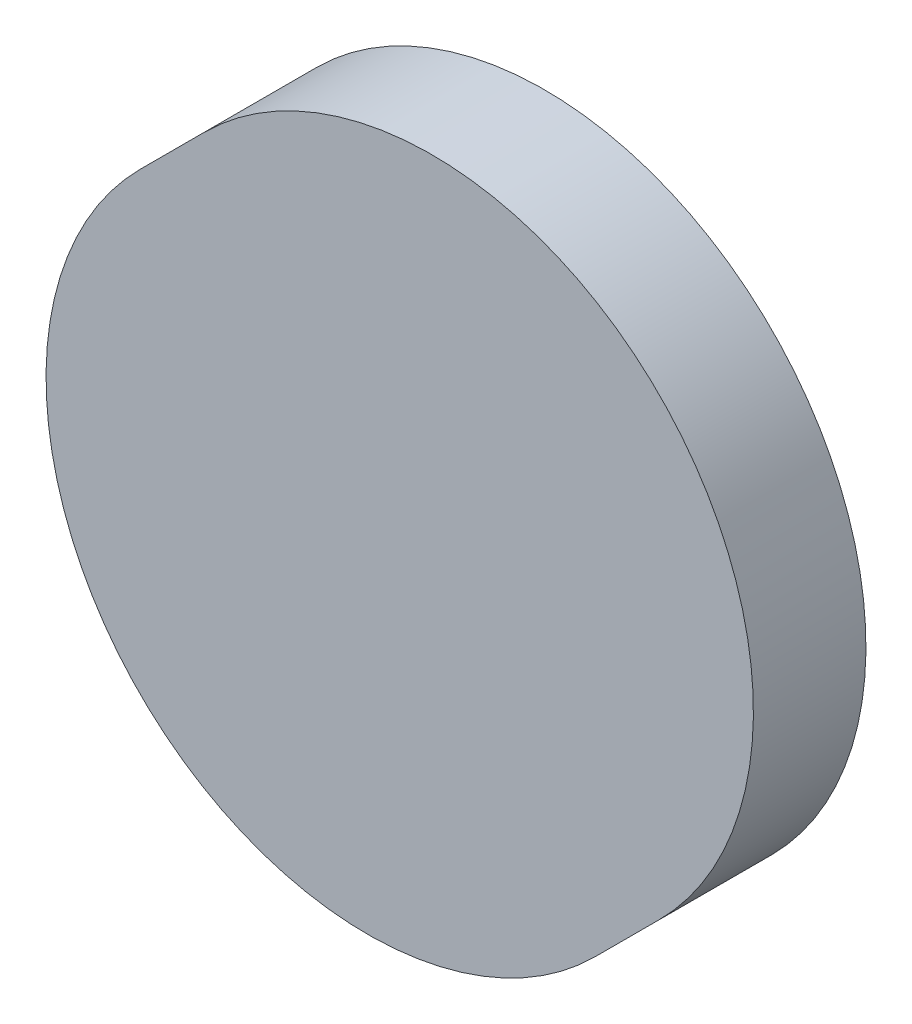
ISO-10303-21;
HEADER;
FILE_DESCRIPTION(('STEP AP214'),'2;1');
FILE_NAME('part.step','',(''),(''),'','','');
FILE_SCHEMA(('AUTOMOTIVE_DESIGN { 1 0 10303 214 1 1 1 1 }'));
ENDSEC;
DATA;
#1=APPLICATION_CONTEXT('core data for automotive mechanical design processes');
#2=APPLICATION_PROTOCOL_DEFINITION('international standard','automotive_design',2000,#1);
#3=PRODUCT_CONTEXT('',#1,'mechanical');
#4=PRODUCT('Part','Part','',(#3));
#5=PRODUCT_RELATED_PRODUCT_CATEGORY('part','',(#4));
#6=PRODUCT_DEFINITION_FORMATION('','',#4);
#7=PRODUCT_DEFINITION_CONTEXT('part definition',#1,'design');
#8=PRODUCT_DEFINITION('design','',#6,#7);
#9=PRODUCT_DEFINITION_SHAPE('','',#8);
#10=(LENGTH_UNIT() NAMED_UNIT(*) SI_UNIT(.MILLI.,.METRE.));
#11=(NAMED_UNIT(*) PLANE_ANGLE_UNIT() SI_UNIT($,.RADIAN.));
#12=(NAMED_UNIT(*) SI_UNIT($,.STERADIAN.) SOLID_ANGLE_UNIT());
#13=UNCERTAINTY_MEASURE_WITH_UNIT(LENGTH_MEASURE(1.E-05),#10,'distance_accuracy_value','');
#14=(GEOMETRIC_REPRESENTATION_CONTEXT(3) GLOBAL_UNCERTAINTY_ASSIGNED_CONTEXT((#13)) GLOBAL_UNIT_ASSIGNED_CONTEXT((#10,
#11,#12)) REPRESENTATION_CONTEXT('',''));
#15=CARTESIAN_POINT('',(0.,0.,0.));
#16=DIRECTION('',(0.,0.,1.));
#17=DIRECTION('',(1.,0.,0.));
#18=AXIS2_PLACEMENT_3D('',#15,#16,#17);
#19=CARTESIAN_POINT('',(88.55071,-136.10571,1.635));
#20=DIRECTION('',(0.,0.,1.));
#21=DIRECTION('',(1.,0.,0.));
#22=AXIS2_PLACEMENT_3D('',#19,#20,#21);
#23=PLANE('',#22);
#24=DIRECTION('',(0.707106781187048,0.707106781186048,0.));
#25=VECTOR('',#24,1.);
#26=CARTESIAN_POINT('',(88.55071,-136.10571,1.635));
#27=LINE('',#26,#25);
#28=CARTESIAN_POINT('',(88.55071,-136.10571,1.635));
#29=VERTEX_POINT('',#28);
#30=CARTESIAN_POINT('',(88.57071,-136.08571,1.635));
#31=VERTEX_POINT('',#30);
#32=EDGE_CURVE('E81',#29,#31,#27,.T.);
#33=ORIENTED_EDGE('',*,*,#32,.T.);
#34=CARTESIAN_POINT('',(88.4999995,-136.0149995,1.635));
#35=DIRECTION('',(0.,0.,1.));
#36=DIRECTION('',(0.707106781186048,-0.707106781187047,0.));
#37=AXIS2_PLACEMENT_3D('',#34,#35,#36);
#38=CIRCLE('',#37,0.09999974810219);
#39=CARTESIAN_POINT('',(88.429289,-135.944289,1.635));
#40=VERTEX_POINT('',#39);
#41=EDGE_CURVE('E108',#31,#40,#38,.T.);
#42=ORIENTED_EDGE('',*,*,#41,.T.);
#43=DIRECTION('',(-0.707106781186048,-0.707106781187048,0.));
#44=VECTOR('',#43,1.);
#45=CARTESIAN_POINT('',(88.429289,-135.944289,1.635));
#46=LINE('',#45,#44);
#47=CARTESIAN_POINT('',(88.409289,-135.964289,1.635));
#48=VERTEX_POINT('',#47);
#49=EDGE_CURVE('E74',#40,#48,#46,.T.);
#50=ORIENTED_EDGE('',*,*,#49,.T.);
#51=CARTESIAN_POINT('',(88.4799995,-136.0349995,1.635));
#52=DIRECTION('',(0.,0.,1.));
#53=DIRECTION('',(-0.707106781186548,0.707106781186548,0.));
#54=AXIS2_PLACEMENT_3D('',#51,#52,#53);
#55=CIRCLE('',#54,0.09999974810217);
#56=EDGE_CURVE('E11',#48,#29,#55,.T.);
#57=ORIENTED_EDGE('',*,*,#56,.T.);
#58=EDGE_LOOP('',(#33,#42,#50,#57));
#59=FACE_BOUND('',#58,.T.);
#60=ADVANCED_FACE('F17',(#59),#23,.T.);
#61=CARTESIAN_POINT('',(88.55071,-136.10571,1.6));
#62=DIRECTION('',(0.,0.,1.));
#63=DIRECTION('',(1.,0.,0.));
#64=AXIS2_PLACEMENT_3D('',#61,#62,#63);
#65=PLANE('',#64);
#66=CARTESIAN_POINT('',(88.4799995,-136.0349995,1.6));
#67=DIRECTION('',(0.,0.,1.));
#68=DIRECTION('',(-0.707106781186548,0.707106781186548,0.));
#69=AXIS2_PLACEMENT_3D('',#66,#67,#68);
#70=CIRCLE('',#69,0.09999974810217);
#71=CARTESIAN_POINT('',(88.409289,-135.964289,1.6));
#72=VERTEX_POINT('',#71);
#73=CARTESIAN_POINT('',(88.55071,-136.10571,1.6));
#74=VERTEX_POINT('',#73);
#75=EDGE_CURVE('E25',#72,#74,#70,.T.);
#76=ORIENTED_EDGE('',*,*,#75,.F.);
#77=DIRECTION('',(-0.707106781186048,-0.707106781187048,0.));
#78=VECTOR('',#77,1.);
#79=CARTESIAN_POINT('',(88.429289,-135.944289,1.6));
#80=LINE('',#79,#78);
#81=CARTESIAN_POINT('',(88.429289,-135.944289,1.6));
#82=VERTEX_POINT('',#81);
#83=EDGE_CURVE('E99',#82,#72,#80,.T.);
#84=ORIENTED_EDGE('',*,*,#83,.F.);
#85=CARTESIAN_POINT('',(88.4999995,-136.0149995,1.6));
#86=DIRECTION('',(0.,0.,1.));
#87=DIRECTION('',(0.707106781186048,-0.707106781187047,0.));
#88=AXIS2_PLACEMENT_3D('',#85,#86,#87);
#89=CIRCLE('',#88,0.09999974810219);
#90=CARTESIAN_POINT('',(88.57071,-136.08571,1.6));
#91=VERTEX_POINT('',#90);
#92=EDGE_CURVE('E83',#91,#82,#89,.T.);
#93=ORIENTED_EDGE('',*,*,#92,.F.);
#94=DIRECTION('',(0.707106781187048,0.707106781186048,0.));
#95=VECTOR('',#94,1.);
#96=CARTESIAN_POINT('',(88.55071,-136.10571,1.6));
#97=LINE('',#96,#95);
#98=EDGE_CURVE('E79',#74,#91,#97,.T.);
#99=ORIENTED_EDGE('',*,*,#98,.F.);
#100=EDGE_LOOP('',(#76,#84,#93,#99));
#101=FACE_BOUND('',#100,.T.);
#102=ADVANCED_FACE('F85',(#101),#65,.F.);
#103=CARTESIAN_POINT('',(88.4799995,-136.0349995,1.6));
#104=DIRECTION('',(0.,0.,-1.));
#105=DIRECTION('',(-0.707106781186548,0.707106781186548,0.));
#106=AXIS2_PLACEMENT_3D('',#103,#104,#105);
#107=CYLINDRICAL_SURFACE('',#106,0.09999974810217);
#108=ORIENTED_EDGE('',*,*,#75,.T.);
#109=DIRECTION('',(0.,0.,1.));
#110=VECTOR('',#109,1.);
#111=CARTESIAN_POINT('',(88.55071,-136.10571,1.6));
#112=LINE('',#111,#110);
#113=EDGE_CURVE('E68',#74,#29,#112,.T.);
#114=ORIENTED_EDGE('',*,*,#113,.T.);
#115=ORIENTED_EDGE('',*,*,#56,.F.);
#116=DIRECTION('',(0.,0.,1.));
#117=VECTOR('',#116,1.);
#118=CARTESIAN_POINT('',(88.409289,-135.964289,1.6));
#119=LINE('',#118,#117);
#120=EDGE_CURVE('E71',#72,#48,#119,.T.);
#121=ORIENTED_EDGE('',*,*,#120,.F.);
#122=EDGE_LOOP('',(#108,#114,#115,#121));
#123=FACE_BOUND('',#122,.T.);
#124=ADVANCED_FACE('F67',(#123),#107,.T.);
#125=CARTESIAN_POINT('',(88.429289,-135.944289,1.6));
#126=DIRECTION('',(0.707106781187048,-0.707106781186048,0.));
#127=DIRECTION('',(0.,0.,-1.));
#128=AXIS2_PLACEMENT_3D('',#125,#126,#127);
#129=PLANE('',#128);
#130=ORIENTED_EDGE('',*,*,#83,.T.);
#131=ORIENTED_EDGE('',*,*,#120,.T.);
#132=ORIENTED_EDGE('',*,*,#49,.F.);
#133=DIRECTION('',(0.,0.,1.));
#134=VECTOR('',#133,1.);
#135=CARTESIAN_POINT('',(88.429289,-135.944289,1.6));
#136=LINE('',#135,#134);
#137=EDGE_CURVE('E101',#82,#40,#136,.T.);
#138=ORIENTED_EDGE('',*,*,#137,.F.);
#139=EDGE_LOOP('',(#130,#131,#132,#138));
#140=FACE_BOUND('',#139,.T.);
#141=ADVANCED_FACE('F120',(#140),#129,.F.);
#142=CARTESIAN_POINT('',(88.4999995,-136.0149995,1.6));
#143=DIRECTION('',(0.,0.,-1.));
#144=DIRECTION('',(0.707106781186048,-0.707106781187048,0.));
#145=AXIS2_PLACEMENT_3D('',#142,#143,#144);
#146=CYLINDRICAL_SURFACE('',#145,0.09999974810219);
#147=ORIENTED_EDGE('',*,*,#92,.T.);
#148=ORIENTED_EDGE('',*,*,#137,.T.);
#149=ORIENTED_EDGE('',*,*,#41,.F.);
#150=DIRECTION('',(0.,0.,1.));
#151=VECTOR('',#150,1.);
#152=CARTESIAN_POINT('',(88.57071,-136.08571,1.6));
#153=LINE('',#152,#151);
#154=EDGE_CURVE('E89',#91,#31,#153,.T.);
#155=ORIENTED_EDGE('',*,*,#154,.F.);
#156=EDGE_LOOP('',(#147,#148,#149,#155));
#157=FACE_BOUND('',#156,.T.);
#158=ADVANCED_FACE('F122',(#157),#146,.T.);
#159=CARTESIAN_POINT('',(88.55071,-136.10571,1.6));
#160=DIRECTION('',(-0.707106781186048,0.707106781187048,0.));
#161=DIRECTION('',(0.,0.,1.));
#162=AXIS2_PLACEMENT_3D('',#159,#160,#161);
#163=PLANE('',#162);
#164=ORIENTED_EDGE('',*,*,#98,.T.);
#165=ORIENTED_EDGE('',*,*,#154,.T.);
#166=ORIENTED_EDGE('',*,*,#32,.F.);
#167=ORIENTED_EDGE('',*,*,#113,.F.);
#168=EDGE_LOOP('',(#164,#165,#166,#167));
#169=FACE_BOUND('',#168,.T.);
#170=ADVANCED_FACE('F77',(#169),#163,.F.);
#171=CLOSED_SHELL('',(#60,#102,#124,#141,#158,#170));
#172=MANIFOLD_SOLID_BREP('B1',#171);
#173=ADVANCED_BREP_SHAPE_REPRESENTATION('',(#18,#172),#14);
#174=SHAPE_DEFINITION_REPRESENTATION(#9,#173);
ENDSEC;
END-ISO-10303-21;
